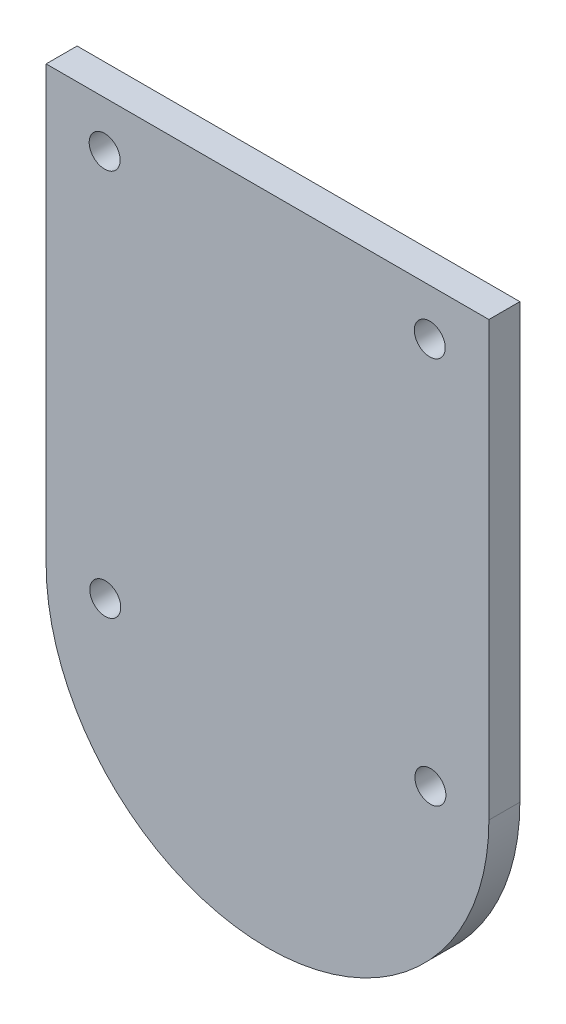
ISO-10303-21;
HEADER;
FILE_DESCRIPTION(('STEP AP214'),'2;1');
FILE_NAME('part.step','',(''),(''),'','','');
FILE_SCHEMA(('AUTOMOTIVE_DESIGN { 1 0 10303 214 1 1 1 1 }'));
ENDSEC;
DATA;
#1=APPLICATION_CONTEXT('core data for automotive mechanical design processes');
#2=APPLICATION_PROTOCOL_DEFINITION('international standard','automotive_design',2000,#1);
#3=PRODUCT_CONTEXT('',#1,'mechanical');
#4=PRODUCT('Part','Part','',(#3));
#5=PRODUCT_RELATED_PRODUCT_CATEGORY('part','',(#4));
#6=PRODUCT_DEFINITION_FORMATION('','',#4);
#7=PRODUCT_DEFINITION_CONTEXT('part definition',#1,'design');
#8=PRODUCT_DEFINITION('design','',#6,#7);
#9=PRODUCT_DEFINITION_SHAPE('','',#8);
#10=(LENGTH_UNIT() NAMED_UNIT(*) SI_UNIT(.MILLI.,.METRE.));
#11=(NAMED_UNIT(*) PLANE_ANGLE_UNIT() SI_UNIT($,.RADIAN.));
#12=(NAMED_UNIT(*) SI_UNIT($,.STERADIAN.) SOLID_ANGLE_UNIT());
#13=UNCERTAINTY_MEASURE_WITH_UNIT(LENGTH_MEASURE(1.E-05),#10,'distance_accuracy_value','');
#14=(GEOMETRIC_REPRESENTATION_CONTEXT(3) GLOBAL_UNCERTAINTY_ASSIGNED_CONTEXT((#13)) GLOBAL_UNIT_ASSIGNED_CONTEXT((#10,
#11,#12)) REPRESENTATION_CONTEXT('',''));
#15=CARTESIAN_POINT('',(0.,0.,0.));
#16=DIRECTION('',(0.,0.,1.));
#17=DIRECTION('',(1.,0.,0.));
#18=AXIS2_PLACEMENT_3D('',#15,#16,#17);
#19=CARTESIAN_POINT('',(14.3,-3.62321671031419,2.));
#20=DIRECTION('',(0.,0.,1.));
#21=DIRECTION('',(1.,0.,0.));
#22=AXIS2_PLACEMENT_3D('',#19,#20,#21);
#23=PLANE('',#22);
#24=CARTESIAN_POINT('',(3.82,-3.62320588658902,2.));
#25=DIRECTION('',(0.,0.,1.));
#26=DIRECTION('',(1.,0.,0.));
#27=AXIS2_PLACEMENT_3D('',#24,#25,#26);
#28=CIRCLE('',#27,1.);
#29=CARTESIAN_POINT('',(4.82,-3.62320588658902,2.));
#30=VERTEX_POINT('',#29);
#31=EDGE_CURVE('E122',#30,#30,#28,.T.);
#32=ORIENTED_EDGE('',*,*,#31,.F.);
#33=EDGE_LOOP('',(#32));
#34=FACE_BOUND('',#33,.T.);
#35=CARTESIAN_POINT('',(24.78,21.376794113411,2.));
#36=DIRECTION('',(0.,0.,1.));
#37=DIRECTION('',(1.,0.,0.));
#38=AXIS2_PLACEMENT_3D('',#35,#36,#37);
#39=CIRCLE('',#38,1.);
#40=CARTESIAN_POINT('',(25.78,21.376794113411,2.));
#41=VERTEX_POINT('',#40);
#42=EDGE_CURVE('E101',#41,#41,#39,.T.);
#43=ORIENTED_EDGE('',*,*,#42,.F.);
#44=EDGE_LOOP('',(#43));
#45=FACE_BOUND('',#44,.T.);
#46=DIRECTION('',(0.,-1.,0.));
#47=VECTOR('',#46,1.);
#48=CARTESIAN_POINT('',(0.,24.376794113411,2.));
#49=LINE('',#48,#47);
#50=CARTESIAN_POINT('',(0.,24.376794113411,2.));
#51=VERTEX_POINT('',#50);
#52=CARTESIAN_POINT('',(0.,-3.62321671031419,2.));
#53=VERTEX_POINT('',#52);
#54=EDGE_CURVE('E86',#51,#53,#49,.T.);
#55=ORIENTED_EDGE('',*,*,#54,.T.);
#56=CARTESIAN_POINT('',(14.3,-3.62321671031419,2.));
#57=DIRECTION('',(0.,0.,1.));
#58=DIRECTION('',(1.,0.,0.));
#59=AXIS2_PLACEMENT_3D('',#56,#57,#58);
#60=CIRCLE('',#59,14.3);
#61=CARTESIAN_POINT('',(28.6,-3.62321671031419,2.));
#62=VERTEX_POINT('',#61);
#63=EDGE_CURVE('E81',#53,#62,#60,.T.);
#64=ORIENTED_EDGE('',*,*,#63,.T.);
#65=DIRECTION('',(0.,1.,0.));
#66=VECTOR('',#65,1.);
#67=CARTESIAN_POINT('',(28.6,-3.62321671031419,2.));
#68=LINE('',#67,#66);
#69=CARTESIAN_POINT('',(28.6,24.376794113411,2.));
#70=VERTEX_POINT('',#69);
#71=EDGE_CURVE('E84',#62,#70,#68,.T.);
#72=ORIENTED_EDGE('',*,*,#71,.T.);
#73=DIRECTION('',(-1.,0.,0.));
#74=VECTOR('',#73,1.);
#75=CARTESIAN_POINT('',(0.,24.376794113411,2.));
#76=LINE('',#75,#74);
#77=EDGE_CURVE('E51',#70,#51,#76,.T.);
#78=ORIENTED_EDGE('',*,*,#77,.T.);
#79=EDGE_LOOP('',(#55,#64,#72,#78));
#80=FACE_BOUND('',#79,.T.);
#81=CARTESIAN_POINT('',(3.78,21.376794113411,2.));
#82=DIRECTION('',(0.,0.,1.));
#83=DIRECTION('',(1.,0.,0.));
#84=AXIS2_PLACEMENT_3D('',#81,#82,#83);
#85=CIRCLE('',#84,1.);
#86=CARTESIAN_POINT('',(4.78,21.376794113411,2.));
#87=VERTEX_POINT('',#86);
#88=EDGE_CURVE('E116',#87,#87,#85,.T.);
#89=ORIENTED_EDGE('',*,*,#88,.F.);
#90=EDGE_LOOP('',(#89));
#91=FACE_BOUND('',#90,.T.);
#92=CARTESIAN_POINT('',(24.82,-3.62320588658901,2.));
#93=DIRECTION('',(0.,0.,1.));
#94=DIRECTION('',(1.,0.,0.));
#95=AXIS2_PLACEMENT_3D('',#92,#93,#94);
#96=CIRCLE('',#95,1.);
#97=CARTESIAN_POINT('',(25.82,-3.62320588658901,2.));
#98=VERTEX_POINT('',#97);
#99=EDGE_CURVE('E128',#98,#98,#96,.T.);
#100=ORIENTED_EDGE('',*,*,#99,.F.);
#101=EDGE_LOOP('',(#100));
#102=FACE_BOUND('',#101,.T.);
#103=ADVANCED_FACE('F34',(#34,#45,#80,#91,#102),#23,.T.);
#104=CARTESIAN_POINT('',(14.3,-3.62321671031419,0.));
#105=DIRECTION('',(0.,0.,1.));
#106=DIRECTION('',(1.,0.,0.));
#107=AXIS2_PLACEMENT_3D('',#104,#105,#106);
#108=PLANE('',#107);
#109=CARTESIAN_POINT('',(3.82,-3.62320588658902,0.));
#110=DIRECTION('',(0.,0.,1.));
#111=DIRECTION('',(1.,0.,0.));
#112=AXIS2_PLACEMENT_3D('',#109,#110,#111);
#113=CIRCLE('',#112,1.);
#114=CARTESIAN_POINT('',(4.82,-3.62320588658902,0.));
#115=VERTEX_POINT('',#114);
#116=EDGE_CURVE('E125',#115,#115,#113,.T.);
#117=ORIENTED_EDGE('',*,*,#116,.T.);
#118=EDGE_LOOP('',(#117));
#119=FACE_BOUND('',#118,.T.);
#120=CARTESIAN_POINT('',(24.78,21.376794113411,0.));
#121=DIRECTION('',(0.,0.,1.));
#122=DIRECTION('',(1.,0.,0.));
#123=AXIS2_PLACEMENT_3D('',#120,#121,#122);
#124=CIRCLE('',#123,1.);
#125=CARTESIAN_POINT('',(25.78,21.376794113411,0.));
#126=VERTEX_POINT('',#125);
#127=EDGE_CURVE('E113',#126,#126,#124,.T.);
#128=ORIENTED_EDGE('',*,*,#127,.T.);
#129=EDGE_LOOP('',(#128));
#130=FACE_BOUND('',#129,.T.);
#131=DIRECTION('',(0.,-1.,0.));
#132=VECTOR('',#131,1.);
#133=CARTESIAN_POINT('',(0.,24.376794113411,0.));
#134=LINE('',#133,#132);
#135=CARTESIAN_POINT('',(0.,24.376794113411,0.));
#136=VERTEX_POINT('',#135);
#137=CARTESIAN_POINT('',(0.,-3.62321671031419,0.));
#138=VERTEX_POINT('',#137);
#139=EDGE_CURVE('E98',#136,#138,#134,.T.);
#140=ORIENTED_EDGE('',*,*,#139,.F.);
#141=DIRECTION('',(-1.,0.,0.));
#142=VECTOR('',#141,1.);
#143=CARTESIAN_POINT('',(0.,24.376794113411,0.));
#144=LINE('',#143,#142);
#145=CARTESIAN_POINT('',(28.6,24.376794113411,0.));
#146=VERTEX_POINT('',#145);
#147=EDGE_CURVE('E74',#146,#136,#144,.T.);
#148=ORIENTED_EDGE('',*,*,#147,.F.);
#149=DIRECTION('',(0.,1.,0.));
#150=VECTOR('',#149,1.);
#151=CARTESIAN_POINT('',(28.6,-3.62321671031419,0.));
#152=LINE('',#151,#150);
#153=CARTESIAN_POINT('',(28.6,-3.62321671031419,0.));
#154=VERTEX_POINT('',#153);
#155=EDGE_CURVE('E68',#154,#146,#152,.T.);
#156=ORIENTED_EDGE('',*,*,#155,.F.);
#157=CARTESIAN_POINT('',(14.3,-3.62321671031419,0.));
#158=DIRECTION('',(0.,0.,1.));
#159=DIRECTION('',(1.,0.,0.));
#160=AXIS2_PLACEMENT_3D('',#157,#158,#159);
#161=CIRCLE('',#160,14.3);
#162=EDGE_CURVE('E90',#138,#154,#161,.T.);
#163=ORIENTED_EDGE('',*,*,#162,.F.);
#164=EDGE_LOOP('',(#140,#148,#156,#163));
#165=FACE_BOUND('',#164,.T.);
#166=CARTESIAN_POINT('',(3.78,21.376794113411,0.));
#167=DIRECTION('',(0.,0.,1.));
#168=DIRECTION('',(1.,0.,0.));
#169=AXIS2_PLACEMENT_3D('',#166,#167,#168);
#170=CIRCLE('',#169,1.);
#171=CARTESIAN_POINT('',(4.78,21.376794113411,0.));
#172=VERTEX_POINT('',#171);
#173=EDGE_CURVE('E119',#172,#172,#170,.T.);
#174=ORIENTED_EDGE('',*,*,#173,.T.);
#175=EDGE_LOOP('',(#174));
#176=FACE_BOUND('',#175,.T.);
#177=CARTESIAN_POINT('',(24.82,-3.62320588658901,0.));
#178=DIRECTION('',(0.,0.,1.));
#179=DIRECTION('',(1.,0.,0.));
#180=AXIS2_PLACEMENT_3D('',#177,#178,#179);
#181=CIRCLE('',#180,1.);
#182=CARTESIAN_POINT('',(25.82,-3.62320588658901,0.));
#183=VERTEX_POINT('',#182);
#184=EDGE_CURVE('E131',#183,#183,#181,.T.);
#185=ORIENTED_EDGE('',*,*,#184,.T.);
#186=EDGE_LOOP('',(#185));
#187=FACE_BOUND('',#186,.T.);
#188=ADVANCED_FACE('F109',(#119,#130,#165,#176,#187),#108,.F.);
#189=CARTESIAN_POINT('',(0.,24.376794113411,2.));
#190=DIRECTION('',(1.,0.,0.));
#191=DIRECTION('',(0.,0.,-1.));
#192=AXIS2_PLACEMENT_3D('',#189,#190,#191);
#193=PLANE('',#192);
#194=ORIENTED_EDGE('',*,*,#139,.T.);
#195=DIRECTION('',(0.,0.,-1.));
#196=VECTOR('',#195,1.);
#197=CARTESIAN_POINT('',(0.,-3.62321671031419,2.));
#198=LINE('',#197,#196);
#199=EDGE_CURVE('E11',#53,#138,#198,.T.);
#200=ORIENTED_EDGE('',*,*,#199,.F.);
#201=ORIENTED_EDGE('',*,*,#54,.F.);
#202=DIRECTION('',(0.,0.,-1.));
#203=VECTOR('',#202,1.);
#204=CARTESIAN_POINT('',(0.,24.376794113411,2.));
#205=LINE('',#204,#203);
#206=EDGE_CURVE('E94',#51,#136,#205,.T.);
#207=ORIENTED_EDGE('',*,*,#206,.T.);
#208=EDGE_LOOP('',(#194,#200,#201,#207));
#209=FACE_BOUND('',#208,.T.);
#210=ADVANCED_FACE('F36',(#209),#193,.F.);
#211=CARTESIAN_POINT('',(14.3,-3.62321671031419,2.));
#212=DIRECTION('',(0.,0.,-1.));
#213=DIRECTION('',(-1.,0.,0.));
#214=AXIS2_PLACEMENT_3D('',#211,#212,#213);
#215=CYLINDRICAL_SURFACE('',#214,14.3);
#216=ORIENTED_EDGE('',*,*,#162,.T.);
#217=DIRECTION('',(0.,0.,-1.));
#218=VECTOR('',#217,1.);
#219=CARTESIAN_POINT('',(28.6,-3.62321671031419,2.));
#220=LINE('',#219,#218);
#221=EDGE_CURVE('E43',#62,#154,#220,.T.);
#222=ORIENTED_EDGE('',*,*,#221,.F.);
#223=ORIENTED_EDGE('',*,*,#63,.F.);
#224=ORIENTED_EDGE('',*,*,#199,.T.);
#225=EDGE_LOOP('',(#216,#222,#223,#224));
#226=FACE_BOUND('',#225,.T.);
#227=ADVANCED_FACE('F89',(#226),#215,.T.);
#228=CARTESIAN_POINT('',(28.6,-3.62321671031419,2.));
#229=DIRECTION('',(-1.,0.,0.));
#230=DIRECTION('',(0.,0.,1.));
#231=AXIS2_PLACEMENT_3D('',#228,#229,#230);
#232=PLANE('',#231);
#233=ORIENTED_EDGE('',*,*,#155,.T.);
#234=DIRECTION('',(0.,0.,-1.));
#235=VECTOR('',#234,1.);
#236=CARTESIAN_POINT('',(28.6,24.376794113411,2.));
#237=LINE('',#236,#235);
#238=EDGE_CURVE('E91',#70,#146,#237,.T.);
#239=ORIENTED_EDGE('',*,*,#238,.F.);
#240=ORIENTED_EDGE('',*,*,#71,.F.);
#241=ORIENTED_EDGE('',*,*,#221,.T.);
#242=EDGE_LOOP('',(#233,#239,#240,#241));
#243=FACE_BOUND('',#242,.T.);
#244=ADVANCED_FACE('F92',(#243),#232,.F.);
#245=CARTESIAN_POINT('',(0.,24.376794113411,2.));
#246=DIRECTION('',(0.,-1.,0.));
#247=DIRECTION('',(0.,0.,-1.));
#248=AXIS2_PLACEMENT_3D('',#245,#246,#247);
#249=PLANE('',#248);
#250=ORIENTED_EDGE('',*,*,#147,.T.);
#251=ORIENTED_EDGE('',*,*,#206,.F.);
#252=ORIENTED_EDGE('',*,*,#77,.F.);
#253=ORIENTED_EDGE('',*,*,#238,.T.);
#254=EDGE_LOOP('',(#250,#251,#252,#253));
#255=FACE_BOUND('',#254,.T.);
#256=ADVANCED_FACE('F106',(#255),#249,.F.);
#257=CARTESIAN_POINT('',(24.78,21.376794113411,2.));
#258=DIRECTION('',(0.,0.,-1.));
#259=DIRECTION('',(-1.,0.,0.));
#260=AXIS2_PLACEMENT_3D('',#257,#258,#259);
#261=CYLINDRICAL_SURFACE('',#260,1.);
#262=ORIENTED_EDGE('',*,*,#42,.T.);
#263=EDGE_LOOP('',(#262));
#264=FACE_BOUND('',#263,.T.);
#265=ORIENTED_EDGE('',*,*,#127,.F.);
#266=EDGE_LOOP('',(#265));
#267=FACE_BOUND('',#266,.T.);
#268=ADVANCED_FACE('F151',(#264,#267),#261,.F.);
#269=CARTESIAN_POINT('',(3.78,21.376794113411,2.));
#270=DIRECTION('',(0.,0.,-1.));
#271=DIRECTION('',(-1.,0.,0.));
#272=AXIS2_PLACEMENT_3D('',#269,#270,#271);
#273=CYLINDRICAL_SURFACE('',#272,1.);
#274=ORIENTED_EDGE('',*,*,#88,.T.);
#275=EDGE_LOOP('',(#274));
#276=FACE_BOUND('',#275,.T.);
#277=ORIENTED_EDGE('',*,*,#173,.F.);
#278=EDGE_LOOP('',(#277));
#279=FACE_BOUND('',#278,.T.);
#280=ADVANCED_FACE('F200',(#276,#279),#273,.F.);
#281=CARTESIAN_POINT('',(3.82,-3.62320588658902,2.));
#282=DIRECTION('',(0.,0.,-1.));
#283=DIRECTION('',(-1.,0.,0.));
#284=AXIS2_PLACEMENT_3D('',#281,#282,#283);
#285=CYLINDRICAL_SURFACE('',#284,1.);
#286=ORIENTED_EDGE('',*,*,#31,.T.);
#287=EDGE_LOOP('',(#286));
#288=FACE_BOUND('',#287,.T.);
#289=ORIENTED_EDGE('',*,*,#116,.F.);
#290=EDGE_LOOP('',(#289));
#291=FACE_BOUND('',#290,.T.);
#292=ADVANCED_FACE('F208',(#288,#291),#285,.F.);
#293=CARTESIAN_POINT('',(24.82,-3.62320588658901,2.));
#294=DIRECTION('',(0.,0.,-1.));
#295=DIRECTION('',(-1.,0.,0.));
#296=AXIS2_PLACEMENT_3D('',#293,#294,#295);
#297=CYLINDRICAL_SURFACE('',#296,1.);
#298=ORIENTED_EDGE('',*,*,#99,.T.);
#299=EDGE_LOOP('',(#298));
#300=FACE_BOUND('',#299,.T.);
#301=ORIENTED_EDGE('',*,*,#184,.F.);
#302=EDGE_LOOP('',(#301));
#303=FACE_BOUND('',#302,.T.);
#304=ADVANCED_FACE('F137',(#300,#303),#297,.F.);
#305=CLOSED_SHELL('',(#103,#188,#210,#227,#244,#256,#268,#280,#292,#304));
#306=MANIFOLD_SOLID_BREP('B2',#305);
#307=ADVANCED_BREP_SHAPE_REPRESENTATION('',(#18,#306),#14);
#308=SHAPE_DEFINITION_REPRESENTATION(#9,#307);
ENDSEC;
END-ISO-10303-21;
